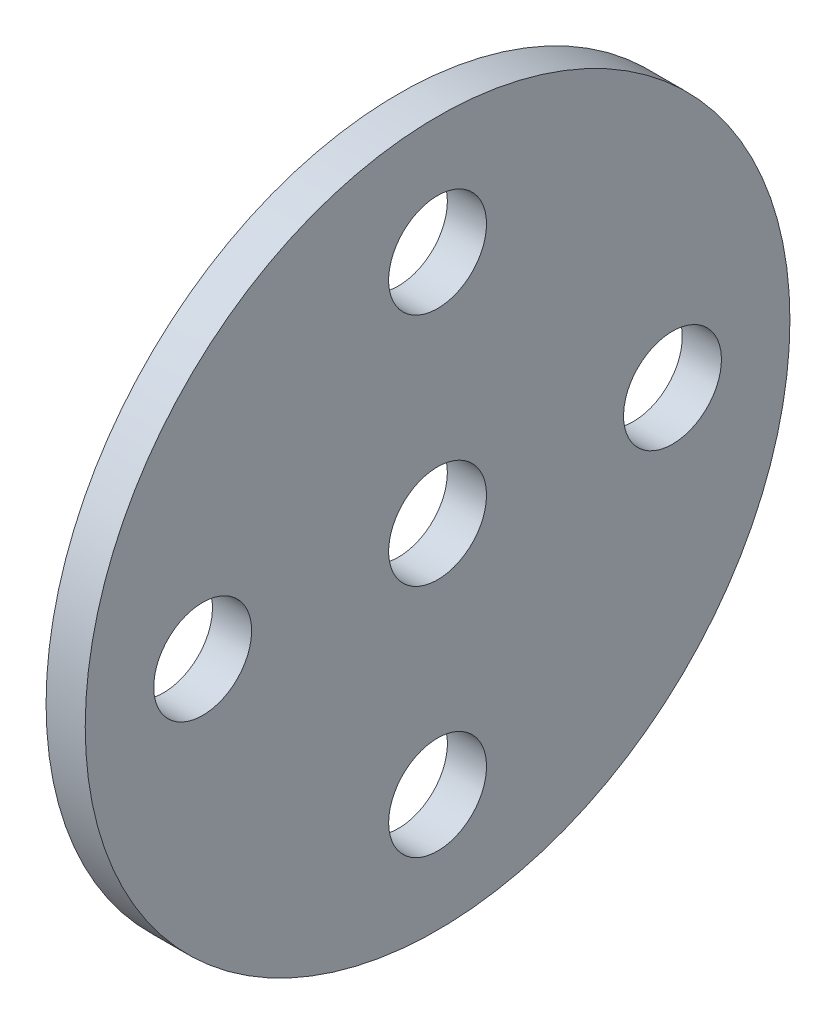
ISO-10303-21;
HEADER;
FILE_DESCRIPTION(('STEP AP214'),'2;1');
FILE_NAME('part.step','',(''),(''),'','','');
FILE_SCHEMA(('AUTOMOTIVE_DESIGN { 1 0 10303 214 1 1 1 1 }'));
ENDSEC;
DATA;
#1=APPLICATION_CONTEXT('core data for automotive mechanical design processes');
#2=APPLICATION_PROTOCOL_DEFINITION('international standard','automotive_design',2000,#1);
#3=PRODUCT_CONTEXT('',#1,'mechanical');
#4=PRODUCT('Part','Part','',(#3));
#5=PRODUCT_RELATED_PRODUCT_CATEGORY('part','',(#4));
#6=PRODUCT_DEFINITION_FORMATION('','',#4);
#7=PRODUCT_DEFINITION_CONTEXT('part definition',#1,'design');
#8=PRODUCT_DEFINITION('design','',#6,#7);
#9=PRODUCT_DEFINITION_SHAPE('','',#8);
#10=(LENGTH_UNIT() NAMED_UNIT(*) SI_UNIT(.MILLI.,.METRE.));
#11=(NAMED_UNIT(*) PLANE_ANGLE_UNIT() SI_UNIT($,.RADIAN.));
#12=(NAMED_UNIT(*) SI_UNIT($,.STERADIAN.) SOLID_ANGLE_UNIT());
#13=UNCERTAINTY_MEASURE_WITH_UNIT(LENGTH_MEASURE(1.E-05),#10,'distance_accuracy_value','');
#14=(GEOMETRIC_REPRESENTATION_CONTEXT(3) GLOBAL_UNCERTAINTY_ASSIGNED_CONTEXT((#13)) GLOBAL_UNIT_ASSIGNED_CONTEXT((#10,
#11,#12)) REPRESENTATION_CONTEXT('',''));
#15=CARTESIAN_POINT('',(0.,0.,0.));
#16=DIRECTION('',(0.,0.,1.));
#17=DIRECTION('',(1.,0.,0.));
#18=AXIS2_PLACEMENT_3D('',#15,#16,#17);
#19=CARTESIAN_POINT('',(3.175,0.,0.));
#20=DIRECTION('',(1.,0.,0.));
#21=DIRECTION('',(0.,0.,-1.));
#22=AXIS2_PLACEMENT_3D('',#19,#20,#21);
#23=PLANE('',#22);
#24=CARTESIAN_POINT('',(3.175,0.,19.05));
#25=DIRECTION('',(1.,0.,0.));
#26=DIRECTION('',(0.,1.,0.));
#27=AXIS2_PLACEMENT_3D('',#24,#25,#26);
#28=CIRCLE('',#27,3.96875);
#29=CARTESIAN_POINT('',(3.175,3.96874999999993,19.05));
#30=VERTEX_POINT('',#29);
#31=EDGE_CURVE('E53',#30,#30,#28,.T.);
#32=ORIENTED_EDGE('',*,*,#31,.F.);
#33=EDGE_LOOP('',(#32));
#34=FACE_BOUND('',#33,.T.);
#35=CARTESIAN_POINT('',(3.175,-19.05,0.));
#36=DIRECTION('',(1.,0.,0.));
#37=DIRECTION('',(0.,0.,1.));
#38=AXIS2_PLACEMENT_3D('',#35,#36,#37);
#39=CIRCLE('',#38,3.96875);
#40=CARTESIAN_POINT('',(3.175,-19.05,3.96875));
#41=VERTEX_POINT('',#40);
#42=EDGE_CURVE('E65',#41,#41,#39,.T.);
#43=ORIENTED_EDGE('',*,*,#42,.F.);
#44=EDGE_LOOP('',(#43));
#45=FACE_BOUND('',#44,.T.);
#46=CARTESIAN_POINT('',(3.175,1.99538158514885E-13,-19.05));
#47=DIRECTION('',(1.,0.,0.));
#48=DIRECTION('',(0.,-1.,0.));
#49=AXIS2_PLACEMENT_3D('',#46,#47,#48);
#50=CIRCLE('',#49,3.96875);
#51=CARTESIAN_POINT('',(3.175,-3.9687499999998,-19.05));
#52=VERTEX_POINT('',#51);
#53=EDGE_CURVE('E59',#52,#52,#50,.T.);
#54=ORIENTED_EDGE('',*,*,#53,.F.);
#55=EDGE_LOOP('',(#54));
#56=FACE_BOUND('',#55,.T.);
#57=CARTESIAN_POINT('',(3.175,19.05,0.));
#58=DIRECTION('',(1.,0.,0.));
#59=DIRECTION('',(0.,0.,-1.));
#60=AXIS2_PLACEMENT_3D('',#57,#58,#59);
#61=CIRCLE('',#60,3.96875);
#62=CARTESIAN_POINT('',(3.175,19.05,-3.96875));
#63=VERTEX_POINT('',#62);
#64=EDGE_CURVE('E47',#63,#63,#61,.T.);
#65=ORIENTED_EDGE('',*,*,#64,.F.);
#66=EDGE_LOOP('',(#65));
#67=FACE_BOUND('',#66,.T.);
#68=CARTESIAN_POINT('',(3.175,0.,0.));
#69=DIRECTION('',(1.,0.,0.));
#70=DIRECTION('',(0.,0.,-1.));
#71=AXIS2_PLACEMENT_3D('',#68,#69,#70);
#72=CIRCLE('',#71,28.575);
#73=CARTESIAN_POINT('',(3.175,0.,-28.575));
#74=VERTEX_POINT('',#73);
#75=EDGE_CURVE('E10',#74,#74,#72,.T.);
#76=ORIENTED_EDGE('',*,*,#75,.T.);
#77=EDGE_LOOP('',(#76));
#78=FACE_BOUND('',#77,.T.);
#79=CARTESIAN_POINT('',(3.175,0.,0.));
#80=DIRECTION('',(1.,0.,0.));
#81=DIRECTION('',(0.,0.,-1.));
#82=AXIS2_PLACEMENT_3D('',#79,#80,#81);
#83=CIRCLE('',#82,3.96875);
#84=CARTESIAN_POINT('',(3.175,0.,-3.96875));
#85=VERTEX_POINT('',#84);
#86=EDGE_CURVE('E42',#85,#85,#83,.T.);
#87=ORIENTED_EDGE('',*,*,#86,.F.);
#88=EDGE_LOOP('',(#87));
#89=FACE_BOUND('',#88,.T.);
#90=ADVANCED_FACE('F31',(#34,#45,#56,#67,#78,#89),#23,.T.);
#91=CARTESIAN_POINT('',(0.,0.,0.));
#92=DIRECTION('',(1.,0.,0.));
#93=DIRECTION('',(0.,0.,-1.));
#94=AXIS2_PLACEMENT_3D('',#91,#92,#93);
#95=PLANE('',#94);
#96=CARTESIAN_POINT('',(0.,0.,19.05));
#97=DIRECTION('',(1.,0.,0.));
#98=DIRECTION('',(0.,1.,0.));
#99=AXIS2_PLACEMENT_3D('',#96,#97,#98);
#100=CIRCLE('',#99,3.96875);
#101=CARTESIAN_POINT('',(0.,3.96874999999993,19.05));
#102=VERTEX_POINT('',#101);
#103=EDGE_CURVE('E68',#102,#102,#100,.T.);
#104=ORIENTED_EDGE('',*,*,#103,.T.);
#105=EDGE_LOOP('',(#104));
#106=FACE_BOUND('',#105,.T.);
#107=CARTESIAN_POINT('',(0.,-19.05,0.));
#108=DIRECTION('',(1.,0.,0.));
#109=DIRECTION('',(0.,0.,1.));
#110=AXIS2_PLACEMENT_3D('',#107,#108,#109);
#111=CIRCLE('',#110,3.96875);
#112=CARTESIAN_POINT('',(0.,-19.05,3.96875));
#113=VERTEX_POINT('',#112);
#114=EDGE_CURVE('E62',#113,#113,#111,.T.);
#115=ORIENTED_EDGE('',*,*,#114,.T.);
#116=EDGE_LOOP('',(#115));
#117=FACE_BOUND('',#116,.T.);
#118=CARTESIAN_POINT('',(0.,1.99538158514885E-13,-19.05));
#119=DIRECTION('',(1.,0.,0.));
#120=DIRECTION('',(0.,-1.,0.));
#121=AXIS2_PLACEMENT_3D('',#118,#119,#120);
#122=CIRCLE('',#121,3.96875);
#123=CARTESIAN_POINT('',(0.,-3.9687499999998,-19.05));
#124=VERTEX_POINT('',#123);
#125=EDGE_CURVE('E56',#124,#124,#122,.T.);
#126=ORIENTED_EDGE('',*,*,#125,.T.);
#127=EDGE_LOOP('',(#126));
#128=FACE_BOUND('',#127,.T.);
#129=CARTESIAN_POINT('',(0.,19.05,0.));
#130=DIRECTION('',(1.,0.,0.));
#131=DIRECTION('',(0.,0.,-1.));
#132=AXIS2_PLACEMENT_3D('',#129,#130,#131);
#133=CIRCLE('',#132,3.96875);
#134=CARTESIAN_POINT('',(0.,19.05,-3.96875));
#135=VERTEX_POINT('',#134);
#136=EDGE_CURVE('E50',#135,#135,#133,.T.);
#137=ORIENTED_EDGE('',*,*,#136,.T.);
#138=EDGE_LOOP('',(#137));
#139=FACE_BOUND('',#138,.T.);
#140=CARTESIAN_POINT('',(0.,0.,0.));
#141=DIRECTION('',(1.,0.,0.));
#142=DIRECTION('',(0.,0.,-1.));
#143=AXIS2_PLACEMENT_3D('',#140,#141,#142);
#144=CIRCLE('',#143,28.575);
#145=CARTESIAN_POINT('',(0.,0.,-28.575));
#146=VERTEX_POINT('',#145);
#147=EDGE_CURVE('E35',#146,#146,#144,.T.);
#148=ORIENTED_EDGE('',*,*,#147,.F.);
#149=EDGE_LOOP('',(#148));
#150=FACE_BOUND('',#149,.T.);
#151=CARTESIAN_POINT('',(0.,0.,0.));
#152=DIRECTION('',(1.,0.,0.));
#153=DIRECTION('',(0.,0.,-1.));
#154=AXIS2_PLACEMENT_3D('',#151,#152,#153);
#155=CIRCLE('',#154,3.96875);
#156=CARTESIAN_POINT('',(0.,0.,-3.96875));
#157=VERTEX_POINT('',#156);
#158=EDGE_CURVE('E44',#157,#157,#155,.T.);
#159=ORIENTED_EDGE('',*,*,#158,.T.);
#160=EDGE_LOOP('',(#159));
#161=FACE_BOUND('',#160,.T.);
#162=ADVANCED_FACE('F79',(#106,#117,#128,#139,#150,#161),#95,.F.);
#163=CARTESIAN_POINT('',(3.175,0.,0.));
#164=DIRECTION('',(-1.,0.,0.));
#165=DIRECTION('',(0.,0.,1.));
#166=AXIS2_PLACEMENT_3D('',#163,#164,#165);
#167=CYLINDRICAL_SURFACE('',#166,28.575);
#168=ORIENTED_EDGE('',*,*,#75,.F.);
#169=EDGE_LOOP('',(#168));
#170=FACE_BOUND('',#169,.T.);
#171=ORIENTED_EDGE('',*,*,#147,.T.);
#172=EDGE_LOOP('',(#171));
#173=FACE_BOUND('',#172,.T.);
#174=ADVANCED_FACE('F33',(#170,#173),#167,.T.);
#175=CARTESIAN_POINT('',(3.175,0.,0.));
#176=DIRECTION('',(-1.,0.,0.));
#177=DIRECTION('',(0.,0.,1.));
#178=AXIS2_PLACEMENT_3D('',#175,#176,#177);
#179=CYLINDRICAL_SURFACE('',#178,3.96875);
#180=ORIENTED_EDGE('',*,*,#86,.T.);
#181=EDGE_LOOP('',(#180));
#182=FACE_BOUND('',#181,.T.);
#183=ORIENTED_EDGE('',*,*,#158,.F.);
#184=EDGE_LOOP('',(#183));
#185=FACE_BOUND('',#184,.T.);
#186=ADVANCED_FACE('F89',(#182,#185),#179,.F.);
#187=CARTESIAN_POINT('',(3.175,19.05,0.));
#188=DIRECTION('',(-1.,0.,0.));
#189=DIRECTION('',(0.,0.,1.));
#190=AXIS2_PLACEMENT_3D('',#187,#188,#189);
#191=CYLINDRICAL_SURFACE('',#190,3.96875);
#192=ORIENTED_EDGE('',*,*,#64,.T.);
#193=EDGE_LOOP('',(#192));
#194=FACE_BOUND('',#193,.T.);
#195=ORIENTED_EDGE('',*,*,#136,.F.);
#196=EDGE_LOOP('',(#195));
#197=FACE_BOUND('',#196,.T.);
#198=ADVANCED_FACE('F92',(#194,#197),#191,.F.);
#199=CARTESIAN_POINT('',(3.175,1.99538158514885E-13,-19.05));
#200=DIRECTION('',(-1.,0.,0.));
#201=DIRECTION('',(0.,0.,1.));
#202=AXIS2_PLACEMENT_3D('',#199,#200,#201);
#203=CYLINDRICAL_SURFACE('',#202,3.96875);
#204=ORIENTED_EDGE('',*,*,#53,.T.);
#205=EDGE_LOOP('',(#204));
#206=FACE_BOUND('',#205,.T.);
#207=ORIENTED_EDGE('',*,*,#125,.F.);
#208=EDGE_LOOP('',(#207));
#209=FACE_BOUND('',#208,.T.);
#210=ADVANCED_FACE('F106',(#206,#209),#203,.F.);
#211=CARTESIAN_POINT('',(3.175,-19.05,0.));
#212=DIRECTION('',(-1.,0.,0.));
#213=DIRECTION('',(0.,0.,1.));
#214=AXIS2_PLACEMENT_3D('',#211,#212,#213);
#215=CYLINDRICAL_SURFACE('',#214,3.96875);
#216=ORIENTED_EDGE('',*,*,#42,.T.);
#217=EDGE_LOOP('',(#216));
#218=FACE_BOUND('',#217,.T.);
#219=ORIENTED_EDGE('',*,*,#114,.F.);
#220=EDGE_LOOP('',(#219));
#221=FACE_BOUND('',#220,.T.);
#222=ADVANCED_FACE('F110',(#218,#221),#215,.F.);
#223=CARTESIAN_POINT('',(3.175,0.,19.05));
#224=DIRECTION('',(-1.,0.,0.));
#225=DIRECTION('',(0.,0.,1.));
#226=AXIS2_PLACEMENT_3D('',#223,#224,#225);
#227=CYLINDRICAL_SURFACE('',#226,3.96875);
#228=ORIENTED_EDGE('',*,*,#31,.T.);
#229=EDGE_LOOP('',(#228));
#230=FACE_BOUND('',#229,.T.);
#231=ORIENTED_EDGE('',*,*,#103,.F.);
#232=EDGE_LOOP('',(#231));
#233=FACE_BOUND('',#232,.T.);
#234=ADVANCED_FACE('F74',(#230,#233),#227,.F.);
#235=CLOSED_SHELL('',(#90,#162,#174,#186,#198,#210,#222,#234));
#236=MANIFOLD_SOLID_BREP('B2',#235);
#237=ADVANCED_BREP_SHAPE_REPRESENTATION('',(#18,#236),#14);
#238=SHAPE_DEFINITION_REPRESENTATION(#9,#237);
ENDSEC;
END-ISO-10303-21;
